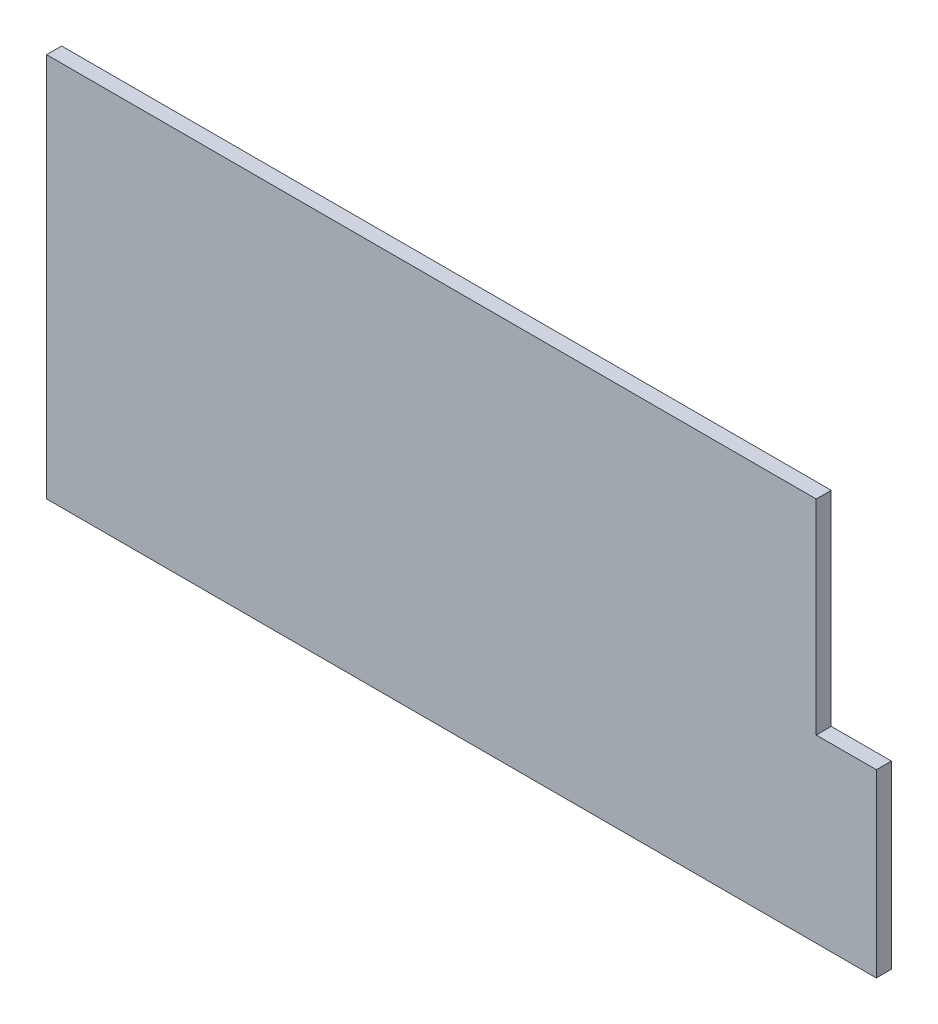
ISO-10303-21;
HEADER;
FILE_DESCRIPTION(('STEP AP214'),'2;1');
FILE_NAME('part.step','',(''),(''),'','','');
FILE_SCHEMA(('AUTOMOTIVE_DESIGN { 1 0 10303 214 1 1 1 1 }'));
ENDSEC;
DATA;
#1=APPLICATION_CONTEXT('core data for automotive mechanical design processes');
#2=APPLICATION_PROTOCOL_DEFINITION('international standard','automotive_design',2000,#1);
#3=PRODUCT_CONTEXT('',#1,'mechanical');
#4=PRODUCT('Part','Part','',(#3));
#5=PRODUCT_RELATED_PRODUCT_CATEGORY('part','',(#4));
#6=PRODUCT_DEFINITION_FORMATION('','',#4);
#7=PRODUCT_DEFINITION_CONTEXT('part definition',#1,'design');
#8=PRODUCT_DEFINITION('design','',#6,#7);
#9=PRODUCT_DEFINITION_SHAPE('','',#8);
#10=(LENGTH_UNIT() NAMED_UNIT(*) SI_UNIT(.MILLI.,.METRE.));
#11=(NAMED_UNIT(*) PLANE_ANGLE_UNIT() SI_UNIT($,.RADIAN.));
#12=(NAMED_UNIT(*) SI_UNIT($,.STERADIAN.) SOLID_ANGLE_UNIT());
#13=UNCERTAINTY_MEASURE_WITH_UNIT(LENGTH_MEASURE(1.E-05),#10,'distance_accuracy_value','');
#14=(GEOMETRIC_REPRESENTATION_CONTEXT(3) GLOBAL_UNCERTAINTY_ASSIGNED_CONTEXT((#13)) GLOBAL_UNIT_ASSIGNED_CONTEXT((#10,
#11,#12)) REPRESENTATION_CONTEXT('',''));
#15=CARTESIAN_POINT('',(0.,0.,0.));
#16=DIRECTION('',(0.,0.,1.));
#17=DIRECTION('',(1.,0.,0.));
#18=AXIS2_PLACEMENT_3D('',#15,#16,#17);
#19=CARTESIAN_POINT('',(0.,0.,5.));
#20=DIRECTION('',(1.,0.,0.));
#21=DIRECTION('',(0.,0.,-1.));
#22=AXIS2_PLACEMENT_3D('',#19,#20,#21);
#23=PLANE('',#22);
#24=DIRECTION('',(0.,-1.,0.));
#25=VECTOR('',#24,1.);
#26=CARTESIAN_POINT('',(0.,0.,0.));
#27=LINE('',#26,#25);
#28=CARTESIAN_POINT('',(0.,128.,0.));
#29=VERTEX_POINT('',#28);
#30=CARTESIAN_POINT('',(0.,0.,0.));
#31=VERTEX_POINT('',#30);
#32=EDGE_CURVE('E117',#29,#31,#27,.T.);
#33=ORIENTED_EDGE('',*,*,#32,.T.);
#34=DIRECTION('',(0.,0.,-1.));
#35=VECTOR('',#34,1.);
#36=CARTESIAN_POINT('',(0.,0.,5.));
#37=LINE('',#36,#35);
#38=CARTESIAN_POINT('',(0.,0.,5.));
#39=VERTEX_POINT('',#38);
#40=EDGE_CURVE('E11',#39,#31,#37,.T.);
#41=ORIENTED_EDGE('',*,*,#40,.F.);
#42=DIRECTION('',(0.,-1.,0.));
#43=VECTOR('',#42,1.);
#44=CARTESIAN_POINT('',(0.,0.,5.));
#45=LINE('',#44,#43);
#46=CARTESIAN_POINT('',(0.,128.,5.));
#47=VERTEX_POINT('',#46);
#48=EDGE_CURVE('E127',#47,#39,#45,.T.);
#49=ORIENTED_EDGE('',*,*,#48,.F.);
#50=DIRECTION('',(0.,0.,-1.));
#51=VECTOR('',#50,1.);
#52=CARTESIAN_POINT('',(0.,128.,5.));
#53=LINE('',#52,#51);
#54=EDGE_CURVE('E113',#47,#29,#53,.T.);
#55=ORIENTED_EDGE('',*,*,#54,.T.);
#56=EDGE_LOOP('',(#33,#41,#49,#55));
#57=FACE_BOUND('',#56,.T.);
#58=ADVANCED_FACE('F33',(#57),#23,.F.);
#59=CARTESIAN_POINT('',(0.,0.,5.));
#60=DIRECTION('',(0.,1.,0.));
#61=DIRECTION('',(0.,0.,1.));
#62=AXIS2_PLACEMENT_3D('',#59,#60,#61);
#63=PLANE('',#62);
#64=DIRECTION('',(1.,0.,0.));
#65=VECTOR('',#64,1.);
#66=CARTESIAN_POINT('',(0.,0.,0.));
#67=LINE('',#66,#65);
#68=CARTESIAN_POINT('',(276.,0.,0.));
#69=VERTEX_POINT('',#68);
#70=EDGE_CURVE('E120',#31,#69,#67,.T.);
#71=ORIENTED_EDGE('',*,*,#70,.T.);
#72=DIRECTION('',(0.,0.,-1.));
#73=VECTOR('',#72,1.);
#74=CARTESIAN_POINT('',(276.,0.,5.));
#75=LINE('',#74,#73);
#76=CARTESIAN_POINT('',(276.,0.,5.));
#77=VERTEX_POINT('',#76);
#78=EDGE_CURVE('E41',#77,#69,#75,.T.);
#79=ORIENTED_EDGE('',*,*,#78,.F.);
#80=DIRECTION('',(1.,0.,0.));
#81=VECTOR('',#80,1.);
#82=CARTESIAN_POINT('',(0.,0.,5.));
#83=LINE('',#82,#81);
#84=EDGE_CURVE('E86',#39,#77,#83,.T.);
#85=ORIENTED_EDGE('',*,*,#84,.F.);
#86=ORIENTED_EDGE('',*,*,#40,.T.);
#87=EDGE_LOOP('',(#71,#79,#85,#86));
#88=FACE_BOUND('',#87,.T.);
#89=ADVANCED_FACE('F151',(#88),#63,.F.);
#90=CARTESIAN_POINT('',(276.,0.,5.));
#91=DIRECTION('',(-1.,0.,0.));
#92=DIRECTION('',(0.,0.,1.));
#93=AXIS2_PLACEMENT_3D('',#90,#91,#92);
#94=PLANE('',#93);
#95=DIRECTION('',(0.,1.,0.));
#96=VECTOR('',#95,1.);
#97=CARTESIAN_POINT('',(276.,0.,0.));
#98=LINE('',#97,#96);
#99=CARTESIAN_POINT('',(276.,60.,0.));
#100=VERTEX_POINT('',#99);
#101=EDGE_CURVE('E122',#69,#100,#98,.T.);
#102=ORIENTED_EDGE('',*,*,#101,.T.);
#103=DIRECTION('',(0.,0.,-1.));
#104=VECTOR('',#103,1.);
#105=CARTESIAN_POINT('',(276.,60.,5.));
#106=LINE('',#105,#104);
#107=CARTESIAN_POINT('',(276.,60.,5.));
#108=VERTEX_POINT('',#107);
#109=EDGE_CURVE('E108',#108,#100,#106,.T.);
#110=ORIENTED_EDGE('',*,*,#109,.F.);
#111=DIRECTION('',(0.,1.,0.));
#112=VECTOR('',#111,1.);
#113=CARTESIAN_POINT('',(276.,0.,5.));
#114=LINE('',#113,#112);
#115=EDGE_CURVE('E99',#77,#108,#114,.T.);
#116=ORIENTED_EDGE('',*,*,#115,.F.);
#117=ORIENTED_EDGE('',*,*,#78,.T.);
#118=EDGE_LOOP('',(#102,#110,#116,#117));
#119=FACE_BOUND('',#118,.T.);
#120=ADVANCED_FACE('F133',(#119),#94,.F.);
#121=CARTESIAN_POINT('',(276.,60.,5.));
#122=DIRECTION('',(0.,-1.,0.));
#123=DIRECTION('',(0.,0.,-1.));
#124=AXIS2_PLACEMENT_3D('',#121,#122,#123);
#125=PLANE('',#124);
#126=DIRECTION('',(-1.,0.,0.));
#127=VECTOR('',#126,1.);
#128=CARTESIAN_POINT('',(276.,60.,0.));
#129=LINE('',#128,#127);
#130=CARTESIAN_POINT('',(256.,60.,0.));
#131=VERTEX_POINT('',#130);
#132=EDGE_CURVE('E107',#100,#131,#129,.T.);
#133=ORIENTED_EDGE('',*,*,#132,.T.);
#134=DIRECTION('',(0.,0.,-1.));
#135=VECTOR('',#134,1.);
#136=CARTESIAN_POINT('',(256.,60.,5.));
#137=LINE('',#136,#135);
#138=CARTESIAN_POINT('',(256.,60.,5.));
#139=VERTEX_POINT('',#138);
#140=EDGE_CURVE('E104',#139,#131,#137,.T.);
#141=ORIENTED_EDGE('',*,*,#140,.F.);
#142=DIRECTION('',(-1.,0.,0.));
#143=VECTOR('',#142,1.);
#144=CARTESIAN_POINT('',(276.,60.,5.));
#145=LINE('',#144,#143);
#146=EDGE_CURVE('E93',#108,#139,#145,.T.);
#147=ORIENTED_EDGE('',*,*,#146,.F.);
#148=ORIENTED_EDGE('',*,*,#109,.T.);
#149=EDGE_LOOP('',(#133,#141,#147,#148));
#150=FACE_BOUND('',#149,.T.);
#151=ADVANCED_FACE('F105',(#150),#125,.F.);
#152=CARTESIAN_POINT('',(256.,128.,5.));
#153=DIRECTION('',(-1.,0.,0.));
#154=DIRECTION('',(0.,0.,1.));
#155=AXIS2_PLACEMENT_3D('',#152,#153,#154);
#156=PLANE('',#155);
#157=DIRECTION('',(0.,1.,0.));
#158=VECTOR('',#157,1.);
#159=CARTESIAN_POINT('',(256.,128.,0.));
#160=LINE('',#159,#158);
#161=CARTESIAN_POINT('',(256.,128.,0.));
#162=VERTEX_POINT('',#161);
#163=EDGE_CURVE('E72',#131,#162,#160,.T.);
#164=ORIENTED_EDGE('',*,*,#163,.T.);
#165=DIRECTION('',(0.,0.,-1.));
#166=VECTOR('',#165,1.);
#167=CARTESIAN_POINT('',(256.,128.,5.));
#168=LINE('',#167,#166);
#169=CARTESIAN_POINT('',(256.,128.,5.));
#170=VERTEX_POINT('',#169);
#171=EDGE_CURVE('E109',#170,#162,#168,.T.);
#172=ORIENTED_EDGE('',*,*,#171,.F.);
#173=DIRECTION('',(0.,1.,0.));
#174=VECTOR('',#173,1.);
#175=CARTESIAN_POINT('',(256.,128.,5.));
#176=LINE('',#175,#174);
#177=EDGE_CURVE('E97',#139,#170,#176,.T.);
#178=ORIENTED_EDGE('',*,*,#177,.F.);
#179=ORIENTED_EDGE('',*,*,#140,.T.);
#180=EDGE_LOOP('',(#164,#172,#178,#179));
#181=FACE_BOUND('',#180,.T.);
#182=ADVANCED_FACE('F111',(#181),#156,.F.);
#183=CARTESIAN_POINT('',(0.,128.,5.));
#184=DIRECTION('',(0.,-1.,0.));
#185=DIRECTION('',(0.,0.,-1.));
#186=AXIS2_PLACEMENT_3D('',#183,#184,#185);
#187=PLANE('',#186);
#188=DIRECTION('',(-1.,0.,0.));
#189=VECTOR('',#188,1.);
#190=CARTESIAN_POINT('',(0.,128.,0.));
#191=LINE('',#190,#189);
#192=EDGE_CURVE('E78',#162,#29,#191,.T.);
#193=ORIENTED_EDGE('',*,*,#192,.T.);
#194=ORIENTED_EDGE('',*,*,#54,.F.);
#195=DIRECTION('',(-1.,0.,0.));
#196=VECTOR('',#195,1.);
#197=CARTESIAN_POINT('',(0.,128.,5.));
#198=LINE('',#197,#196);
#199=EDGE_CURVE('E49',#170,#47,#198,.T.);
#200=ORIENTED_EDGE('',*,*,#199,.F.);
#201=ORIENTED_EDGE('',*,*,#171,.T.);
#202=EDGE_LOOP('',(#193,#194,#200,#201));
#203=FACE_BOUND('',#202,.T.);
#204=ADVANCED_FACE('F140',(#203),#187,.F.);
#205=CARTESIAN_POINT('',(0.,0.,5.));
#206=DIRECTION('',(0.,0.,-1.));
#207=DIRECTION('',(-1.,0.,0.));
#208=AXIS2_PLACEMENT_3D('',#205,#206,#207);
#209=PLANE('',#208);
#210=ORIENTED_EDGE('',*,*,#48,.T.);
#211=ORIENTED_EDGE('',*,*,#84,.T.);
#212=ORIENTED_EDGE('',*,*,#115,.T.);
#213=ORIENTED_EDGE('',*,*,#146,.T.);
#214=ORIENTED_EDGE('',*,*,#177,.T.);
#215=ORIENTED_EDGE('',*,*,#199,.T.);
#216=EDGE_LOOP('',(#210,#211,#212,#213,#214,#215));
#217=FACE_BOUND('',#216,.T.);
#218=ADVANCED_FACE('F95',(#217),#209,.F.);
#219=CARTESIAN_POINT('',(0.,0.,0.));
#220=DIRECTION('',(0.,0.,-1.));
#221=DIRECTION('',(-1.,0.,0.));
#222=AXIS2_PLACEMENT_3D('',#219,#220,#221);
#223=PLANE('',#222);
#224=ORIENTED_EDGE('',*,*,#32,.F.);
#225=ORIENTED_EDGE('',*,*,#192,.F.);
#226=ORIENTED_EDGE('',*,*,#163,.F.);
#227=ORIENTED_EDGE('',*,*,#132,.F.);
#228=ORIENTED_EDGE('',*,*,#101,.F.);
#229=ORIENTED_EDGE('',*,*,#70,.F.);
#230=EDGE_LOOP('',(#224,#225,#226,#227,#228,#229));
#231=FACE_BOUND('',#230,.T.);
#232=ADVANCED_FACE('F136',(#231),#223,.T.);
#233=CLOSED_SHELL('',(#58,#89,#120,#151,#182,#204,#218,#232));
#234=MANIFOLD_SOLID_BREP('B2',#233);
#235=ADVANCED_BREP_SHAPE_REPRESENTATION('',(#18,#234),#14);
#236=SHAPE_DEFINITION_REPRESENTATION(#9,#235);
ENDSEC;
END-ISO-10303-21;
